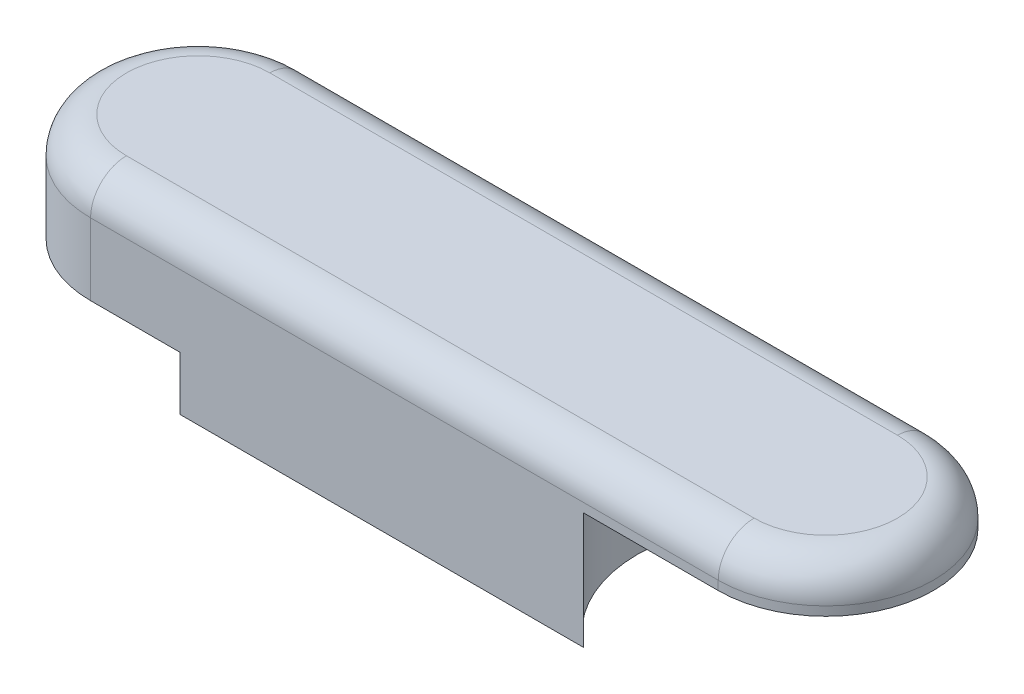
ISO-10303-21;
HEADER;
FILE_DESCRIPTION(('STEP AP214'),'2;1');
FILE_NAME('part.step','',(''),(''),'','','');
FILE_SCHEMA(('AUTOMOTIVE_DESIGN { 1 0 10303 214 1 1 1 1 }'));
ENDSEC;
DATA;
#1=APPLICATION_CONTEXT('core data for automotive mechanical design processes');
#2=APPLICATION_PROTOCOL_DEFINITION('international standard','automotive_design',2000,#1);
#3=PRODUCT_CONTEXT('',#1,'mechanical');
#4=PRODUCT('Part','Part','',(#3));
#5=PRODUCT_RELATED_PRODUCT_CATEGORY('part','',(#4));
#6=PRODUCT_DEFINITION_FORMATION('','',#4);
#7=PRODUCT_DEFINITION_CONTEXT('part definition',#1,'design');
#8=PRODUCT_DEFINITION('design','',#6,#7);
#9=PRODUCT_DEFINITION_SHAPE('','',#8);
#10=(LENGTH_UNIT() NAMED_UNIT(*) SI_UNIT(.MILLI.,.METRE.));
#11=(NAMED_UNIT(*) PLANE_ANGLE_UNIT() SI_UNIT($,.RADIAN.));
#12=(NAMED_UNIT(*) SI_UNIT($,.STERADIAN.) SOLID_ANGLE_UNIT());
#13=UNCERTAINTY_MEASURE_WITH_UNIT(LENGTH_MEASURE(1.E-05),#10,'distance_accuracy_value','');
#14=(GEOMETRIC_REPRESENTATION_CONTEXT(3) GLOBAL_UNCERTAINTY_ASSIGNED_CONTEXT((#13)) GLOBAL_UNIT_ASSIGNED_CONTEXT((#10,
#11,#12)) REPRESENTATION_CONTEXT('',''));
#15=CARTESIAN_POINT('',(0.,0.,0.));
#16=DIRECTION('',(0.,0.,1.));
#17=DIRECTION('',(1.,0.,0.));
#18=AXIS2_PLACEMENT_3D('',#15,#16,#17);
#19=CARTESIAN_POINT('',(0.,-45.,-60.));
#20=DIRECTION('',(0.,0.,-1.));
#21=DIRECTION('',(-1.,0.,0.));
#22=AXIS2_PLACEMENT_3D('',#19,#20,#21);
#23=PLANE('',#22);
#24=DIRECTION('',(0.,1.,0.));
#25=VECTOR('',#24,1.);
#26=CARTESIAN_POINT('',(-350.,-45.,-60.));
#27=LINE('',#26,#25);
#28=CARTESIAN_POINT('',(-350.,-15.,-60.));
#29=VERTEX_POINT('',#28);
#30=CARTESIAN_POINT('',(-350.,25.,-60.));
#31=VERTEX_POINT('',#30);
#32=EDGE_CURVE('E174',#29,#31,#27,.T.);
#33=ORIENTED_EDGE('',*,*,#32,.T.);
#34=DIRECTION('',(-1.,0.,0.));
#35=VECTOR('',#34,1.);
#36=CARTESIAN_POINT('',(0.,25.,-60.));
#37=LINE('',#36,#35);
#38=CARTESIAN_POINT('',(0.,25.,-60.));
#39=VERTEX_POINT('',#38);
#40=EDGE_CURVE('E11',#31,#39,#37,.F.);
#41=ORIENTED_EDGE('',*,*,#40,.T.);
#42=DIRECTION('',(0.,1.,0.));
#43=VECTOR('',#42,1.);
#44=CARTESIAN_POINT('',(0.,-45.,-60.));
#45=LINE('',#44,#43);
#46=CARTESIAN_POINT('',(0.,20.,-60.));
#47=VERTEX_POINT('',#46);
#48=EDGE_CURVE('E175',#47,#39,#45,.T.);
#49=ORIENTED_EDGE('',*,*,#48,.F.);
#50=DIRECTION('',(-1.,0.,0.));
#51=VECTOR('',#50,1.);
#52=CARTESIAN_POINT('',(60.,20.,-60.));
#53=LINE('',#52,#51);
#54=CARTESIAN_POINT('',(-75.,20.,-60.));
#55=VERTEX_POINT('',#54);
#56=EDGE_CURVE('E166',#47,#55,#53,.T.);
#57=ORIENTED_EDGE('',*,*,#56,.T.);
#58=DIRECTION('',(0.,-1.,0.));
#59=VECTOR('',#58,1.);
#60=CARTESIAN_POINT('',(-75.,187.705098312484,-60.));
#61=LINE('',#60,#59);
#62=CARTESIAN_POINT('',(-75.,-45.,-60.));
#63=VERTEX_POINT('',#62);
#64=EDGE_CURVE('E158',#63,#55,#61,.F.);
#65=ORIENTED_EDGE('',*,*,#64,.F.);
#66=DIRECTION('',(-1.,0.,0.));
#67=VECTOR('',#66,1.);
#68=CARTESIAN_POINT('',(0.,-45.,-60.));
#69=LINE('',#68,#67);
#70=CARTESIAN_POINT('',(-300.,-45.,-60.));
#71=VERTEX_POINT('',#70);
#72=EDGE_CURVE('E145',#63,#71,#69,.T.);
#73=ORIENTED_EDGE('',*,*,#72,.T.);
#74=DIRECTION('',(0.,1.,0.));
#75=VECTOR('',#74,1.);
#76=CARTESIAN_POINT('',(-300.,-45.,-60.));
#77=LINE('',#76,#75);
#78=CARTESIAN_POINT('',(-300.,-15.,-60.));
#79=VERTEX_POINT('',#78);
#80=EDGE_CURVE('E126',#71,#79,#77,.T.);
#81=ORIENTED_EDGE('',*,*,#80,.T.);
#82=DIRECTION('',(-1.,0.,0.));
#83=VECTOR('',#82,1.);
#84=CARTESIAN_POINT('',(-410.,-15.,-59.9999999999999));
#85=LINE('',#84,#83);
#86=EDGE_CURVE('E136',#79,#29,#85,.T.);
#87=ORIENTED_EDGE('',*,*,#86,.T.);
#88=EDGE_LOOP('',(#33,#41,#49,#57,#65,#73,#81,#87));
#89=FACE_BOUND('',#88,.T.);
#90=ADVANCED_FACE('F43',(#89),#23,.T.);
#91=CARTESIAN_POINT('',(0.,-45.,0.));
#92=DIRECTION('',(0.,1.,0.));
#93=DIRECTION('',(0.,0.,1.));
#94=AXIS2_PLACEMENT_3D('',#91,#92,#93);
#95=CYLINDRICAL_SURFACE('',#94,60.);
#96=ORIENTED_EDGE('',*,*,#48,.T.);
#97=CARTESIAN_POINT('',(0.,25.,0.));
#98=DIRECTION('',(0.,1.,0.));
#99=DIRECTION('',(0.,0.,1.));
#100=AXIS2_PLACEMENT_3D('',#97,#98,#99);
#101=CIRCLE('',#100,60.);
#102=CARTESIAN_POINT('',(0.,25.,60.));
#103=VERTEX_POINT('',#102);
#104=EDGE_CURVE('E199',#39,#103,#101,.F.);
#105=ORIENTED_EDGE('',*,*,#104,.T.);
#106=DIRECTION('',(0.,1.,0.));
#107=VECTOR('',#106,1.);
#108=CARTESIAN_POINT('',(0.,-45.,60.));
#109=LINE('',#108,#107);
#110=CARTESIAN_POINT('',(0.,20.,60.));
#111=VERTEX_POINT('',#110);
#112=EDGE_CURVE('E179',#111,#103,#109,.T.);
#113=ORIENTED_EDGE('',*,*,#112,.F.);
#114=CARTESIAN_POINT('',(0.,20.,0.));
#115=DIRECTION('',(0.,1.,0.));
#116=DIRECTION('',(-1.,0.,0.));
#117=AXIS2_PLACEMENT_3D('',#114,#115,#116);
#118=CIRCLE('',#117,60.);
#119=EDGE_CURVE('E168',#47,#111,#118,.F.);
#120=ORIENTED_EDGE('',*,*,#119,.F.);
#121=EDGE_LOOP('',(#96,#105,#113,#120));
#122=FACE_BOUND('',#121,.T.);
#123=ADVANCED_FACE('F238',(#122),#95,.T.);
#124=CARTESIAN_POINT('',(0.,-45.,60.));
#125=DIRECTION('',(0.,0.,-1.));
#126=DIRECTION('',(-1.,0.,0.));
#127=AXIS2_PLACEMENT_3D('',#124,#125,#126);
#128=PLANE('',#127);
#129=ORIENTED_EDGE('',*,*,#112,.T.);
#130=DIRECTION('',(-1.,0.,0.));
#131=VECTOR('',#130,1.);
#132=CARTESIAN_POINT('',(-350.,25.,60.));
#133=LINE('',#132,#131);
#134=CARTESIAN_POINT('',(-350.,25.,60.));
#135=VERTEX_POINT('',#134);
#136=EDGE_CURVE('E67',#103,#135,#133,.T.);
#137=ORIENTED_EDGE('',*,*,#136,.T.);
#138=DIRECTION('',(0.,1.,0.));
#139=VECTOR('',#138,1.);
#140=CARTESIAN_POINT('',(-350.,-45.,60.));
#141=LINE('',#140,#139);
#142=CARTESIAN_POINT('',(-350.,-15.,60.));
#143=VERTEX_POINT('',#142);
#144=EDGE_CURVE('E181',#143,#135,#141,.T.);
#145=ORIENTED_EDGE('',*,*,#144,.F.);
#146=DIRECTION('',(-1.,0.,0.));
#147=VECTOR('',#146,1.);
#148=CARTESIAN_POINT('',(-410.,-15.,60.));
#149=LINE('',#148,#147);
#150=CARTESIAN_POINT('',(-300.,-15.,60.));
#151=VERTEX_POINT('',#150);
#152=EDGE_CURVE('E146',#151,#143,#149,.T.);
#153=ORIENTED_EDGE('',*,*,#152,.F.);
#154=DIRECTION('',(0.,1.,0.));
#155=VECTOR('',#154,1.);
#156=CARTESIAN_POINT('',(-300.,-45.,60.));
#157=LINE('',#156,#155);
#158=CARTESIAN_POINT('',(-300.,-45.,60.));
#159=VERTEX_POINT('',#158);
#160=EDGE_CURVE('E129',#159,#151,#157,.T.);
#161=ORIENTED_EDGE('',*,*,#160,.F.);
#162=DIRECTION('',(-1.,0.,0.));
#163=VECTOR('',#162,1.);
#164=CARTESIAN_POINT('',(0.,-45.,60.));
#165=LINE('',#164,#163);
#166=CARTESIAN_POINT('',(-75.,-45.,60.));
#167=VERTEX_POINT('',#166);
#168=EDGE_CURVE('E171',#167,#159,#165,.T.);
#169=ORIENTED_EDGE('',*,*,#168,.F.);
#170=DIRECTION('',(0.,-1.,0.));
#171=VECTOR('',#170,1.);
#172=CARTESIAN_POINT('',(-75.,187.705098312484,60.));
#173=LINE('',#172,#171);
#174=CARTESIAN_POINT('',(-75.,20.,60.));
#175=VERTEX_POINT('',#174);
#176=EDGE_CURVE('E155',#167,#175,#173,.F.);
#177=ORIENTED_EDGE('',*,*,#176,.T.);
#178=DIRECTION('',(-1.,0.,0.));
#179=VECTOR('',#178,1.);
#180=CARTESIAN_POINT('',(60.,20.,60.));
#181=LINE('',#180,#179);
#182=EDGE_CURVE('E164',#111,#175,#181,.T.);
#183=ORIENTED_EDGE('',*,*,#182,.F.);
#184=EDGE_LOOP('',(#129,#137,#145,#153,#161,#169,#177,#183));
#185=FACE_BOUND('',#184,.T.);
#186=ADVANCED_FACE('F225',(#185),#128,.F.);
#187=CARTESIAN_POINT('',(-350.,-45.,0.));
#188=DIRECTION('',(0.,1.,0.));
#189=DIRECTION('',(0.,0.,1.));
#190=AXIS2_PLACEMENT_3D('',#187,#188,#189);
#191=CYLINDRICAL_SURFACE('',#190,60.);
#192=ORIENTED_EDGE('',*,*,#144,.T.);
#193=CARTESIAN_POINT('',(-350.,25.,0.));
#194=DIRECTION('',(0.,1.,0.));
#195=DIRECTION('',(0.,0.,1.));
#196=AXIS2_PLACEMENT_3D('',#193,#194,#195);
#197=CIRCLE('',#196,60.);
#198=EDGE_CURVE('E52',#135,#31,#197,.F.);
#199=ORIENTED_EDGE('',*,*,#198,.T.);
#200=ORIENTED_EDGE('',*,*,#32,.F.);
#201=CARTESIAN_POINT('',(-350.,-15.,0.));
#202=DIRECTION('',(0.,1.,0.));
#203=DIRECTION('',(0.,0.,1.));
#204=AXIS2_PLACEMENT_3D('',#201,#202,#203);
#205=CIRCLE('',#204,60.);
#206=EDGE_CURVE('E138',#143,#29,#205,.F.);
#207=ORIENTED_EDGE('',*,*,#206,.F.);
#208=EDGE_LOOP('',(#192,#199,#200,#207));
#209=FACE_BOUND('',#208,.T.);
#210=ADVANCED_FACE('F267',(#209),#191,.T.);
#211=CARTESIAN_POINT('',(0.,-45.,0.));
#212=DIRECTION('',(0.,1.,0.));
#213=DIRECTION('',(0.,0.,1.));
#214=AXIS2_PLACEMENT_3D('',#211,#212,#213);
#215=PLANE('',#214);
#216=ORIENTED_EDGE('',*,*,#168,.T.);
#217=CARTESIAN_POINT('',(-300.,-45.,0.));
#218=DIRECTION('',(0.,-1.,0.));
#219=DIRECTION('',(0.,0.,-1.));
#220=AXIS2_PLACEMENT_3D('',#217,#218,#219);
#221=CIRCLE('',#220,60.);
#222=EDGE_CURVE('E133',#71,#159,#221,.T.);
#223=ORIENTED_EDGE('',*,*,#222,.F.);
#224=ORIENTED_EDGE('',*,*,#72,.F.);
#225=CARTESIAN_POINT('',(-30.,-45.,0.));
#226=DIRECTION('',(0.,-1.,0.));
#227=DIRECTION('',(0.,0.,-1.));
#228=AXIS2_PLACEMENT_3D('',#225,#226,#227);
#229=CIRCLE('',#228,75.);
#230=EDGE_CURVE('E140',#167,#63,#229,.T.);
#231=ORIENTED_EDGE('',*,*,#230,.F.);
#232=EDGE_LOOP('',(#216,#223,#224,#231));
#233=FACE_BOUND('',#232,.T.);
#234=ADVANCED_FACE('F227',(#233),#215,.F.);
#235=CARTESIAN_POINT('',(0.,45.,0.));
#236=DIRECTION('',(0.,1.,0.));
#237=DIRECTION('',(0.,0.,1.));
#238=AXIS2_PLACEMENT_3D('',#235,#236,#237);
#239=PLANE('',#238);
#240=DIRECTION('',(-1.,0.,0.));
#241=VECTOR('',#240,1.);
#242=CARTESIAN_POINT('',(0.,45.,40.));
#243=LINE('',#242,#241);
#244=CARTESIAN_POINT('',(-350.,45.,40.));
#245=VERTEX_POINT('',#244);
#246=CARTESIAN_POINT('',(0.,45.,40.));
#247=VERTEX_POINT('',#246);
#248=EDGE_CURVE('E194',#245,#247,#243,.F.);
#249=ORIENTED_EDGE('',*,*,#248,.T.);
#250=CARTESIAN_POINT('',(0.,45.,0.));
#251=DIRECTION('',(0.,1.,0.));
#252=DIRECTION('',(0.,0.,1.));
#253=AXIS2_PLACEMENT_3D('',#250,#251,#252);
#254=CIRCLE('',#253,40.);
#255=CARTESIAN_POINT('',(0.,45.,-40.));
#256=VERTEX_POINT('',#255);
#257=EDGE_CURVE('E196',#247,#256,#254,.T.);
#258=ORIENTED_EDGE('',*,*,#257,.T.);
#259=DIRECTION('',(-1.,0.,0.));
#260=VECTOR('',#259,1.);
#261=CARTESIAN_POINT('',(0.,45.,-40.));
#262=LINE('',#261,#260);
#263=CARTESIAN_POINT('',(-350.,45.,-40.));
#264=VERTEX_POINT('',#263);
#265=EDGE_CURVE('E190',#256,#264,#262,.T.);
#266=ORIENTED_EDGE('',*,*,#265,.T.);
#267=CARTESIAN_POINT('',(-350.,45.,0.));
#268=DIRECTION('',(0.,1.,0.));
#269=DIRECTION('',(0.,0.,1.));
#270=AXIS2_PLACEMENT_3D('',#267,#268,#269);
#271=CIRCLE('',#270,40.);
#272=EDGE_CURVE('E192',#264,#245,#271,.T.);
#273=ORIENTED_EDGE('',*,*,#272,.T.);
#274=EDGE_LOOP('',(#249,#258,#266,#273));
#275=FACE_BOUND('',#274,.T.);
#276=ADVANCED_FACE('F248',(#275),#239,.T.);
#277=CARTESIAN_POINT('',(60.,20.,-171.018016555873));
#278=DIRECTION('',(0.,1.,0.));
#279=DIRECTION('',(-1.,0.,0.));
#280=AXIS2_PLACEMENT_3D('',#277,#278,#279);
#281=PLANE('',#280);
#282=CARTESIAN_POINT('',(0.,20.,0.));
#283=DIRECTION('',(0.,1.,0.));
#284=DIRECTION('',(-1.,0.,0.));
#285=AXIS2_PLACEMENT_3D('',#282,#283,#284);
#286=CIRCLE('',#285,25.);
#287=CARTESIAN_POINT('',(-25.,20.,0.));
#288=VERTEX_POINT('',#287);
#289=EDGE_CURVE('E178',#288,#288,#286,.F.);
#290=ORIENTED_EDGE('',*,*,#289,.F.);
#291=EDGE_LOOP('',(#290));
#292=FACE_BOUND('',#291,.T.);
#293=ORIENTED_EDGE('',*,*,#119,.T.);
#294=ORIENTED_EDGE('',*,*,#182,.T.);
#295=CARTESIAN_POINT('',(-30.,20.,0.));
#296=DIRECTION('',(0.,1.,0.));
#297=DIRECTION('',(-1.,0.,0.));
#298=AXIS2_PLACEMENT_3D('',#295,#296,#297);
#299=CIRCLE('',#298,75.);
#300=EDGE_CURVE('E152',#175,#55,#299,.F.);
#301=ORIENTED_EDGE('',*,*,#300,.T.);
#302=ORIENTED_EDGE('',*,*,#56,.F.);
#303=EDGE_LOOP('',(#293,#294,#301,#302));
#304=FACE_BOUND('',#303,.T.);
#305=ADVANCED_FACE('F234',(#292,#304),#281,.F.);
#306=CARTESIAN_POINT('',(0.,0.,0.));
#307=DIRECTION('',(0.,1.,0.));
#308=DIRECTION('',(-1.,0.,0.));
#309=AXIS2_PLACEMENT_3D('',#306,#307,#308);
#310=CYLINDRICAL_SURFACE('',#309,25.);
#311=CARTESIAN_POINT('',(0.,0.,0.));
#312=DIRECTION('',(0.,-1.,0.));
#313=DIRECTION('',(1.,0.,0.));
#314=AXIS2_PLACEMENT_3D('',#311,#312,#313);
#315=CIRCLE('',#314,25.);
#316=CARTESIAN_POINT('',(25.,0.,0.));
#317=VERTEX_POINT('',#316);
#318=EDGE_CURVE('E161',#317,#317,#315,.T.);
#319=ORIENTED_EDGE('',*,*,#318,.F.);
#320=EDGE_LOOP('',(#319));
#321=FACE_BOUND('',#320,.T.);
#322=ORIENTED_EDGE('',*,*,#289,.T.);
#323=EDGE_LOOP('',(#322));
#324=FACE_BOUND('',#323,.T.);
#325=ADVANCED_FACE('F346',(#321,#324),#310,.T.);
#326=CARTESIAN_POINT('',(0.,0.,0.));
#327=DIRECTION('',(0.,-1.,0.));
#328=DIRECTION('',(1.,0.,0.));
#329=AXIS2_PLACEMENT_3D('',#326,#327,#328);
#330=PLANE('',#329);
#331=ORIENTED_EDGE('',*,*,#318,.T.);
#332=EDGE_LOOP('',(#331));
#333=FACE_BOUND('',#332,.T.);
#334=ADVANCED_FACE('F336',(#333),#330,.T.);
#335=CARTESIAN_POINT('',(-30.,187.705098312484,0.));
#336=DIRECTION('',(0.,-1.,0.));
#337=DIRECTION('',(0.,0.,-1.));
#338=AXIS2_PLACEMENT_3D('',#335,#336,#337);
#339=CYLINDRICAL_SURFACE('',#338,75.);
#340=ORIENTED_EDGE('',*,*,#64,.T.);
#341=ORIENTED_EDGE('',*,*,#300,.F.);
#342=ORIENTED_EDGE('',*,*,#176,.F.);
#343=ORIENTED_EDGE('',*,*,#230,.T.);
#344=EDGE_LOOP('',(#340,#341,#342,#343));
#345=FACE_BOUND('',#344,.T.);
#346=ADVANCED_FACE('F229',(#345),#339,.F.);
#347=CARTESIAN_POINT('',(-410.,-15.,-174.017542509914));
#348=DIRECTION('',(0.,1.,0.));
#349=DIRECTION('',(0.,0.,1.));
#350=AXIS2_PLACEMENT_3D('',#347,#348,#349);
#351=PLANE('',#350);
#352=CARTESIAN_POINT('',(-350.,-15.,0.));
#353=DIRECTION('',(0.,1.,0.));
#354=DIRECTION('',(0.,0.,1.));
#355=AXIS2_PLACEMENT_3D('',#352,#353,#354);
#356=CIRCLE('',#355,30.);
#357=CARTESIAN_POINT('',(-350.,-15.,30.0000000000001));
#358=VERTEX_POINT('',#357);
#359=EDGE_CURVE('E187',#358,#358,#356,.F.);
#360=ORIENTED_EDGE('',*,*,#359,.F.);
#361=EDGE_LOOP('',(#360));
#362=FACE_BOUND('',#361,.T.);
#363=ORIENTED_EDGE('',*,*,#152,.T.);
#364=ORIENTED_EDGE('',*,*,#206,.T.);
#365=ORIENTED_EDGE('',*,*,#86,.F.);
#366=CARTESIAN_POINT('',(-300.,-15.,0.));
#367=DIRECTION('',(0.,1.,0.));
#368=DIRECTION('',(0.,0.,1.));
#369=AXIS2_PLACEMENT_3D('',#366,#367,#368);
#370=CIRCLE('',#369,60.);
#371=EDGE_CURVE('E122',#79,#151,#370,.F.);
#372=ORIENTED_EDGE('',*,*,#371,.T.);
#373=EDGE_LOOP('',(#363,#364,#365,#372));
#374=FACE_BOUND('',#373,.T.);
#375=ADVANCED_FACE('F137',(#362,#374),#351,.F.);
#376=CARTESIAN_POINT('',(-300.,119.164078649987,0.));
#377=DIRECTION('',(0.,-1.,0.));
#378=DIRECTION('',(0.,0.,-1.));
#379=AXIS2_PLACEMENT_3D('',#376,#377,#378);
#380=CYLINDRICAL_SURFACE('',#379,60.);
#381=ORIENTED_EDGE('',*,*,#80,.F.);
#382=ORIENTED_EDGE('',*,*,#222,.T.);
#383=ORIENTED_EDGE('',*,*,#160,.T.);
#384=ORIENTED_EDGE('',*,*,#371,.F.);
#385=EDGE_LOOP('',(#381,#382,#383,#384));
#386=FACE_BOUND('',#385,.T.);
#387=ADVANCED_FACE('F124',(#386),#380,.F.);
#388=CARTESIAN_POINT('',(-350.,-30.,0.));
#389=DIRECTION('',(0.,1.,0.));
#390=DIRECTION('',(0.,0.,1.));
#391=AXIS2_PLACEMENT_3D('',#388,#389,#390);
#392=CYLINDRICAL_SURFACE('',#391,30.);
#393=CARTESIAN_POINT('',(-350.,-30.,0.));
#394=DIRECTION('',(0.,-1.,0.));
#395=DIRECTION('',(0.,0.,-1.));
#396=AXIS2_PLACEMENT_3D('',#393,#394,#395);
#397=CIRCLE('',#396,30.);
#398=CARTESIAN_POINT('',(-350.,-30.,-30.));
#399=VERTEX_POINT('',#398);
#400=EDGE_CURVE('E214',#399,#399,#397,.T.);
#401=ORIENTED_EDGE('',*,*,#400,.F.);
#402=EDGE_LOOP('',(#401));
#403=FACE_BOUND('',#402,.T.);
#404=ORIENTED_EDGE('',*,*,#359,.T.);
#405=EDGE_LOOP('',(#404));
#406=FACE_BOUND('',#405,.T.);
#407=ADVANCED_FACE('F297',(#403,#406),#392,.T.);
#408=CARTESIAN_POINT('',(-350.,-30.,0.));
#409=DIRECTION('',(0.,-1.,0.));
#410=DIRECTION('',(0.,0.,-1.));
#411=AXIS2_PLACEMENT_3D('',#408,#409,#410);
#412=PLANE('',#411);
#413=ORIENTED_EDGE('',*,*,#400,.T.);
#414=EDGE_LOOP('',(#413));
#415=FACE_BOUND('',#414,.T.);
#416=ADVANCED_FACE('F256',(#415),#412,.T.);
#417=CARTESIAN_POINT('',(-350.,25.,0.));
#418=DIRECTION('',(0.,1.,0.));
#419=DIRECTION('',(0.,0.,1.));
#420=AXIS2_PLACEMENT_3D('',#417,#418,#419);
#421=TOROIDAL_SURFACE('',#420,40.,20.);
#422=CARTESIAN_POINT('',(-350.,25.,-40.));
#423=DIRECTION('',(1.,0.,0.));
#424=DIRECTION('',(0.,0.,-1.));
#425=AXIS2_PLACEMENT_3D('',#422,#423,#424);
#426=CIRCLE('',#425,20.);
#427=EDGE_CURVE('E207',#31,#264,#426,.T.);
#428=ORIENTED_EDGE('',*,*,#427,.F.);
#429=ORIENTED_EDGE('',*,*,#198,.F.);
#430=CARTESIAN_POINT('',(-350.,25.,40.));
#431=DIRECTION('',(1.,0.,0.));
#432=DIRECTION('',(0.,0.,-1.));
#433=AXIS2_PLACEMENT_3D('',#430,#431,#432);
#434=CIRCLE('',#433,20.);
#435=EDGE_CURVE('E47',#245,#135,#434,.T.);
#436=ORIENTED_EDGE('',*,*,#435,.F.);
#437=ORIENTED_EDGE('',*,*,#272,.F.);
#438=EDGE_LOOP('',(#428,#429,#436,#437));
#439=FACE_BOUND('',#438,.T.);
#440=ADVANCED_FACE('F45',(#439),#421,.T.);
#441=CARTESIAN_POINT('',(0.,25.,40.));
#442=DIRECTION('',(1.,0.,0.));
#443=DIRECTION('',(0.,0.,-1.));
#444=AXIS2_PLACEMENT_3D('',#441,#442,#443);
#445=CYLINDRICAL_SURFACE('',#444,20.);
#446=ORIENTED_EDGE('',*,*,#435,.T.);
#447=ORIENTED_EDGE('',*,*,#136,.F.);
#448=CARTESIAN_POINT('',(0.,25.,40.));
#449=DIRECTION('',(1.,0.,0.));
#450=DIRECTION('',(0.,0.,-1.));
#451=AXIS2_PLACEMENT_3D('',#448,#449,#450);
#452=CIRCLE('',#451,20.);
#453=EDGE_CURVE('E206',#247,#103,#452,.T.);
#454=ORIENTED_EDGE('',*,*,#453,.F.);
#455=ORIENTED_EDGE('',*,*,#248,.F.);
#456=EDGE_LOOP('',(#446,#447,#454,#455));
#457=FACE_BOUND('',#456,.T.);
#458=ADVANCED_FACE('F249',(#457),#445,.T.);
#459=CARTESIAN_POINT('',(0.,25.,-40.));
#460=DIRECTION('',(-1.,0.,0.));
#461=DIRECTION('',(0.,0.,1.));
#462=AXIS2_PLACEMENT_3D('',#459,#460,#461);
#463=CYLINDRICAL_SURFACE('',#462,20.);
#464=ORIENTED_EDGE('',*,*,#427,.T.);
#465=ORIENTED_EDGE('',*,*,#265,.F.);
#466=CARTESIAN_POINT('',(0.,25.,-40.));
#467=DIRECTION('',(1.,0.,0.));
#468=DIRECTION('',(0.,0.,-1.));
#469=AXIS2_PLACEMENT_3D('',#466,#467,#468);
#470=CIRCLE('',#469,20.);
#471=EDGE_CURVE('E204',#39,#256,#470,.T.);
#472=ORIENTED_EDGE('',*,*,#471,.F.);
#473=ORIENTED_EDGE('',*,*,#40,.F.);
#474=EDGE_LOOP('',(#464,#465,#472,#473));
#475=FACE_BOUND('',#474,.T.);
#476=ADVANCED_FACE('F245',(#475),#463,.T.);
#477=CARTESIAN_POINT('',(0.,25.,0.));
#478=DIRECTION('',(0.,1.,0.));
#479=DIRECTION('',(0.,0.,1.));
#480=AXIS2_PLACEMENT_3D('',#477,#478,#479);
#481=TOROIDAL_SURFACE('',#480,40.,20.);
#482=ORIENTED_EDGE('',*,*,#453,.T.);
#483=ORIENTED_EDGE('',*,*,#104,.F.);
#484=ORIENTED_EDGE('',*,*,#471,.T.);
#485=ORIENTED_EDGE('',*,*,#257,.F.);
#486=EDGE_LOOP('',(#482,#483,#484,#485));
#487=FACE_BOUND('',#486,.T.);
#488=ADVANCED_FACE('F242',(#487),#481,.T.);
#489=CLOSED_SHELL('',(#90,#123,#186,#210,#234,#276,#305,#325,#334,#346,#375,#387,#407,#416,#440,
#458,#476,#488));
#490=MANIFOLD_SOLID_BREP('B2',#489);
#491=ADVANCED_BREP_SHAPE_REPRESENTATION('',(#18,#490),#14);
#492=SHAPE_DEFINITION_REPRESENTATION(#9,#491);
ENDSEC;
END-ISO-10303-21;
